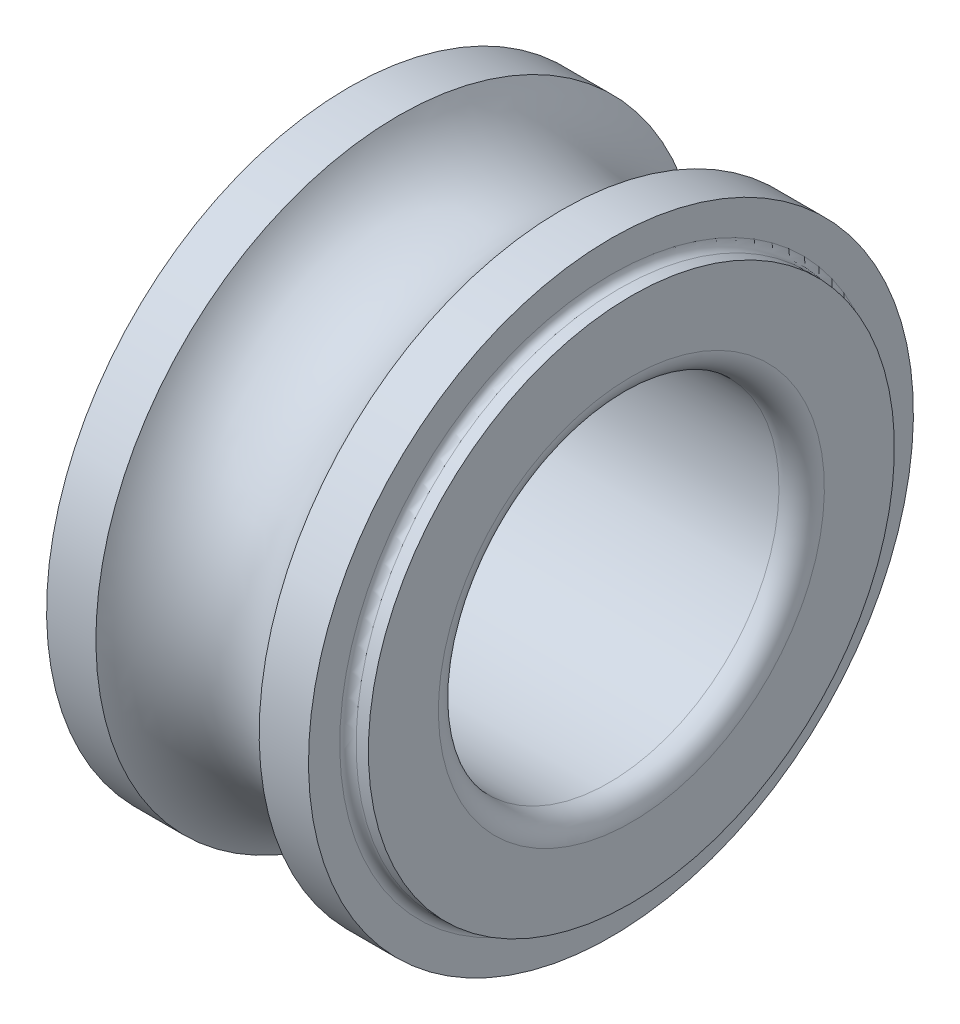
ISO-10303-21;
HEADER;
FILE_DESCRIPTION(('STEP AP214'),'2;1');
FILE_NAME('part.step','',(''),(''),'','','');
FILE_SCHEMA(('AUTOMOTIVE_DESIGN { 1 0 10303 214 1 1 1 1 }'));
ENDSEC;
DATA;
#1=APPLICATION_CONTEXT('core data for automotive mechanical design processes');
#2=APPLICATION_PROTOCOL_DEFINITION('international standard','automotive_design',2000,#1);
#3=PRODUCT_CONTEXT('',#1,'mechanical');
#4=PRODUCT('Part','Part','',(#3));
#5=PRODUCT_RELATED_PRODUCT_CATEGORY('part','',(#4));
#6=PRODUCT_DEFINITION_FORMATION('','',#4);
#7=PRODUCT_DEFINITION_CONTEXT('part definition',#1,'design');
#8=PRODUCT_DEFINITION('design','',#6,#7);
#9=PRODUCT_DEFINITION_SHAPE('','',#8);
#10=(LENGTH_UNIT() NAMED_UNIT(*) SI_UNIT(.MILLI.,.METRE.));
#11=(NAMED_UNIT(*) PLANE_ANGLE_UNIT() SI_UNIT($,.RADIAN.));
#12=(NAMED_UNIT(*) SI_UNIT($,.STERADIAN.) SOLID_ANGLE_UNIT());
#13=UNCERTAINTY_MEASURE_WITH_UNIT(LENGTH_MEASURE(1.E-05),#10,'distance_accuracy_value','');
#14=(GEOMETRIC_REPRESENTATION_CONTEXT(3) GLOBAL_UNCERTAINTY_ASSIGNED_CONTEXT((#13)) GLOBAL_UNIT_ASSIGNED_CONTEXT((#10,
#11,#12)) REPRESENTATION_CONTEXT('',''));
#15=CARTESIAN_POINT('',(0.,0.,0.));
#16=DIRECTION('',(0.,0.,1.));
#17=DIRECTION('',(1.,0.,0.));
#18=AXIS2_PLACEMENT_3D('',#15,#16,#17);
#19=CARTESIAN_POINT('',(0.54,7.57925,0.));
#20=DIRECTION('',(-1.,0.,0.));
#21=DIRECTION('',(0.,-1.,0.));
#22=AXIS2_PLACEMENT_3D('',#19,#20,#21);
#23=PLANE('',#22);
#24=CARTESIAN_POINT('',(0.54,0.,0.));
#25=DIRECTION('',(1.,0.,0.));
#26=DIRECTION('',(0.,1.,0.));
#27=AXIS2_PLACEMENT_3D('',#24,#25,#26);
#28=CIRCLE('',#27,7.166);
#29=CARTESIAN_POINT('',(0.54,7.166,0.));
#30=VERTEX_POINT('',#29);
#31=EDGE_CURVE('E11',#30,#30,#28,.T.);
#32=ORIENTED_EDGE('',*,*,#31,.T.);
#33=EDGE_LOOP('',(#32));
#34=FACE_BOUND('',#33,.T.);
#35=CARTESIAN_POINT('',(0.54,0.,0.));
#36=DIRECTION('',(1.,0.,0.));
#37=DIRECTION('',(0.,1.,0.));
#38=AXIS2_PLACEMENT_3D('',#35,#36,#37);
#39=CIRCLE('',#38,7.9925);
#40=CARTESIAN_POINT('',(0.54,7.9925,0.));
#41=VERTEX_POINT('',#40);
#42=EDGE_CURVE('E75',#41,#41,#39,.T.);
#43=ORIENTED_EDGE('',*,*,#42,.F.);
#44=EDGE_LOOP('',(#43));
#45=FACE_BOUND('',#44,.T.);
#46=ADVANCED_FACE('F16',(#34,#45),#23,.T.);
#47=CARTESIAN_POINT('',(0.324,0.,0.));
#48=DIRECTION('',(1.,0.,0.));
#49=DIRECTION('',(0.,0.,-1.));
#50=AXIS2_PLACEMENT_3D('',#47,#48,#49);
#51=TOROIDAL_SURFACE('',#50,7.166,0.216);
#52=CARTESIAN_POINT('',(0.324,0.,0.));
#53=DIRECTION('',(1.,0.,0.));
#54=DIRECTION('',(0.,1.,0.));
#55=AXIS2_PLACEMENT_3D('',#52,#53,#54);
#56=CIRCLE('',#55,6.95);
#57=CARTESIAN_POINT('',(0.324,6.95,0.));
#58=VERTEX_POINT('',#57);
#59=EDGE_CURVE('E24',#58,#58,#56,.T.);
#60=ORIENTED_EDGE('',*,*,#59,.T.);
#61=EDGE_LOOP('',(#60));
#62=FACE_BOUND('',#61,.T.);
#63=ORIENTED_EDGE('',*,*,#31,.F.);
#64=EDGE_LOOP('',(#63));
#65=FACE_BOUND('',#64,.T.);
#66=ADVANCED_FACE('F121',(#62,#65),#51,.F.);
#67=CARTESIAN_POINT('',(0.162,0.,0.));
#68=DIRECTION('',(-1.,0.,0.));
#69=DIRECTION('',(0.,1.,0.));
#70=AXIS2_PLACEMENT_3D('',#67,#68,#69);
#71=CYLINDRICAL_SURFACE('',#70,6.95);
#72=CARTESIAN_POINT('',(0.,0.,0.));
#73=DIRECTION('',(1.,0.,0.));
#74=DIRECTION('',(0.,1.,0.));
#75=AXIS2_PLACEMENT_3D('',#72,#73,#74);
#76=CIRCLE('',#75,6.95);
#77=CARTESIAN_POINT('',(0.,6.95,0.));
#78=VERTEX_POINT('',#77);
#79=EDGE_CURVE('E92',#78,#78,#76,.T.);
#80=ORIENTED_EDGE('',*,*,#79,.T.);
#81=EDGE_LOOP('',(#80));
#82=FACE_BOUND('',#81,.T.);
#83=ORIENTED_EDGE('',*,*,#59,.F.);
#84=EDGE_LOOP('',(#83));
#85=FACE_BOUND('',#84,.T.);
#86=ADVANCED_FACE('F125',(#82,#85),#71,.T.);
#87=CARTESIAN_POINT('',(0.,6.025,0.));
#88=DIRECTION('',(-1.,0.,0.));
#89=DIRECTION('',(0.,-1.,0.));
#90=AXIS2_PLACEMENT_3D('',#87,#88,#89);
#91=PLANE('',#90);
#92=CARTESIAN_POINT('',(0.,0.,0.));
#93=DIRECTION('',(1.,0.,0.));
#94=DIRECTION('',(0.,1.,0.));
#95=AXIS2_PLACEMENT_3D('',#92,#93,#94);
#96=CIRCLE('',#95,5.1);
#97=CARTESIAN_POINT('',(0.,5.1,0.));
#98=VERTEX_POINT('',#97);
#99=EDGE_CURVE('E90',#98,#98,#96,.T.);
#100=ORIENTED_EDGE('',*,*,#99,.T.);
#101=EDGE_LOOP('',(#100));
#102=FACE_BOUND('',#101,.T.);
#103=ORIENTED_EDGE('',*,*,#79,.F.);
#104=EDGE_LOOP('',(#103));
#105=FACE_BOUND('',#104,.T.);
#106=ADVANCED_FACE('F130',(#102,#105),#91,.T.);
#107=CARTESIAN_POINT('',(0.6,0.,0.));
#108=DIRECTION('',(1.,0.,0.));
#109=DIRECTION('',(0.,0.,-1.));
#110=AXIS2_PLACEMENT_3D('',#107,#108,#109);
#111=TOROIDAL_SURFACE('',#110,5.1,0.6);
#112=CARTESIAN_POINT('',(0.6,0.,0.));
#113=DIRECTION('',(1.,0.,0.));
#114=DIRECTION('',(0.,1.,0.));
#115=AXIS2_PLACEMENT_3D('',#112,#113,#114);
#116=CIRCLE('',#115,4.5);
#117=CARTESIAN_POINT('',(0.6,4.5,0.));
#118=VERTEX_POINT('',#117);
#119=EDGE_CURVE('E93',#118,#118,#116,.T.);
#120=ORIENTED_EDGE('',*,*,#119,.T.);
#121=EDGE_LOOP('',(#120));
#122=FACE_BOUND('',#121,.T.);
#123=ORIENTED_EDGE('',*,*,#99,.F.);
#124=EDGE_LOOP('',(#123));
#125=FACE_BOUND('',#124,.T.);
#126=ADVANCED_FACE('F135',(#122,#125),#111,.T.);
#127=CARTESIAN_POINT('',(4.,0.,0.));
#128=DIRECTION('',(-1.,0.,0.));
#129=DIRECTION('',(0.,1.,0.));
#130=AXIS2_PLACEMENT_3D('',#127,#128,#129);
#131=CYLINDRICAL_SURFACE('',#130,4.5);
#132=CARTESIAN_POINT('',(7.4,0.,0.));
#133=DIRECTION('',(1.,0.,0.));
#134=DIRECTION('',(0.,1.,0.));
#135=AXIS2_PLACEMENT_3D('',#132,#133,#134);
#136=CIRCLE('',#135,4.5);
#137=CARTESIAN_POINT('',(7.4,4.5,0.));
#138=VERTEX_POINT('',#137);
#139=EDGE_CURVE('E19',#138,#138,#136,.T.);
#140=ORIENTED_EDGE('',*,*,#139,.T.);
#141=EDGE_LOOP('',(#140));
#142=FACE_BOUND('',#141,.T.);
#143=ORIENTED_EDGE('',*,*,#119,.F.);
#144=EDGE_LOOP('',(#143));
#145=FACE_BOUND('',#144,.T.);
#146=ADVANCED_FACE('F138',(#142,#145),#131,.F.);
#147=CARTESIAN_POINT('',(7.4,0.,0.));
#148=DIRECTION('',(1.,0.,0.));
#149=DIRECTION('',(0.,0.,-1.));
#150=AXIS2_PLACEMENT_3D('',#147,#148,#149);
#151=TOROIDAL_SURFACE('',#150,5.1,0.6);
#152=CARTESIAN_POINT('',(8.,0.,0.));
#153=DIRECTION('',(1.,0.,0.));
#154=DIRECTION('',(0.,1.,0.));
#155=AXIS2_PLACEMENT_3D('',#152,#153,#154);
#156=CIRCLE('',#155,5.1);
#157=CARTESIAN_POINT('',(8.,5.1,0.));
#158=VERTEX_POINT('',#157);
#159=EDGE_CURVE('E61',#158,#158,#156,.T.);
#160=ORIENTED_EDGE('',*,*,#159,.T.);
#161=EDGE_LOOP('',(#160));
#162=FACE_BOUND('',#161,.T.);
#163=ORIENTED_EDGE('',*,*,#139,.F.);
#164=EDGE_LOOP('',(#163));
#165=FACE_BOUND('',#164,.T.);
#166=ADVANCED_FACE('F192',(#162,#165),#151,.T.);
#167=CARTESIAN_POINT('',(8.,6.025,0.));
#168=DIRECTION('',(1.,0.,0.));
#169=DIRECTION('',(0.,1.,0.));
#170=AXIS2_PLACEMENT_3D('',#167,#168,#169);
#171=PLANE('',#170);
#172=CARTESIAN_POINT('',(8.,0.,0.));
#173=DIRECTION('',(1.,0.,0.));
#174=DIRECTION('',(0.,1.,0.));
#175=AXIS2_PLACEMENT_3D('',#172,#173,#174);
#176=CIRCLE('',#175,6.95);
#177=CARTESIAN_POINT('',(8.,6.95,0.));
#178=VERTEX_POINT('',#177);
#179=EDGE_CURVE('E87',#178,#178,#176,.T.);
#180=ORIENTED_EDGE('',*,*,#179,.T.);
#181=EDGE_LOOP('',(#180));
#182=FACE_BOUND('',#181,.T.);
#183=ORIENTED_EDGE('',*,*,#159,.F.);
#184=EDGE_LOOP('',(#183));
#185=FACE_BOUND('',#184,.T.);
#186=ADVANCED_FACE('F183',(#182,#185),#171,.T.);
#187=CARTESIAN_POINT('',(7.838,0.,0.));
#188=DIRECTION('',(-1.,0.,0.));
#189=DIRECTION('',(0.,1.,0.));
#190=AXIS2_PLACEMENT_3D('',#187,#188,#189);
#191=CYLINDRICAL_SURFACE('',#190,6.95);
#192=CARTESIAN_POINT('',(7.676,0.,0.));
#193=DIRECTION('',(1.,0.,0.));
#194=DIRECTION('',(0.,1.,0.));
#195=AXIS2_PLACEMENT_3D('',#192,#193,#194);
#196=CIRCLE('',#195,6.95);
#197=CARTESIAN_POINT('',(7.676,6.95,0.));
#198=VERTEX_POINT('',#197);
#199=EDGE_CURVE('E86',#198,#198,#196,.T.);
#200=ORIENTED_EDGE('',*,*,#199,.T.);
#201=EDGE_LOOP('',(#200));
#202=FACE_BOUND('',#201,.T.);
#203=ORIENTED_EDGE('',*,*,#179,.F.);
#204=EDGE_LOOP('',(#203));
#205=FACE_BOUND('',#204,.T.);
#206=ADVANCED_FACE('F173',(#202,#205),#191,.T.);
#207=CARTESIAN_POINT('',(7.676,0.,0.));
#208=DIRECTION('',(1.,0.,0.));
#209=DIRECTION('',(0.,0.,-1.));
#210=AXIS2_PLACEMENT_3D('',#207,#208,#209);
#211=TOROIDAL_SURFACE('',#210,7.166,0.216);
#212=CARTESIAN_POINT('',(7.46,0.,0.));
#213=DIRECTION('',(1.,0.,0.));
#214=DIRECTION('',(0.,1.,0.));
#215=AXIS2_PLACEMENT_3D('',#212,#213,#214);
#216=CIRCLE('',#215,7.166);
#217=CARTESIAN_POINT('',(7.46,7.166,0.));
#218=VERTEX_POINT('',#217);
#219=EDGE_CURVE('E88',#218,#218,#216,.T.);
#220=ORIENTED_EDGE('',*,*,#219,.T.);
#221=EDGE_LOOP('',(#220));
#222=FACE_BOUND('',#221,.T.);
#223=ORIENTED_EDGE('',*,*,#199,.F.);
#224=EDGE_LOOP('',(#223));
#225=FACE_BOUND('',#224,.T.);
#226=ADVANCED_FACE('F116',(#222,#225),#211,.F.);
#227=CARTESIAN_POINT('',(7.46,7.57925,0.));
#228=DIRECTION('',(1.,0.,0.));
#229=DIRECTION('',(0.,1.,0.));
#230=AXIS2_PLACEMENT_3D('',#227,#228,#229);
#231=PLANE('',#230);
#232=CARTESIAN_POINT('',(7.46,0.,0.));
#233=DIRECTION('',(1.,0.,0.));
#234=DIRECTION('',(0.,1.,0.));
#235=AXIS2_PLACEMENT_3D('',#232,#233,#234);
#236=CIRCLE('',#235,7.9925);
#237=CARTESIAN_POINT('',(7.46,7.9925,0.));
#238=VERTEX_POINT('',#237);
#239=EDGE_CURVE('E82',#238,#238,#236,.T.);
#240=ORIENTED_EDGE('',*,*,#239,.T.);
#241=EDGE_LOOP('',(#240));
#242=FACE_BOUND('',#241,.T.);
#243=ORIENTED_EDGE('',*,*,#219,.F.);
#244=EDGE_LOOP('',(#243));
#245=FACE_BOUND('',#244,.T.);
#246=ADVANCED_FACE('F101',(#242,#245),#231,.T.);
#247=CARTESIAN_POINT('',(6.80866871072633,0.,0.));
#248=DIRECTION('',(-1.,0.,0.));
#249=DIRECTION('',(0.,1.,0.));
#250=AXIS2_PLACEMENT_3D('',#247,#248,#249);
#251=CYLINDRICAL_SURFACE('',#250,7.9925);
#252=CARTESIAN_POINT('',(6.15733742145266,0.,0.));
#253=DIRECTION('',(1.,0.,0.));
#254=DIRECTION('',(0.,1.,0.));
#255=AXIS2_PLACEMENT_3D('',#252,#253,#254);
#256=CIRCLE('',#255,7.9925);
#257=CARTESIAN_POINT('',(6.15733742145266,7.9925,0.));
#258=VERTEX_POINT('',#257);
#259=EDGE_CURVE('E79',#258,#258,#256,.T.);
#260=ORIENTED_EDGE('',*,*,#259,.T.);
#261=EDGE_LOOP('',(#260));
#262=FACE_BOUND('',#261,.T.);
#263=ORIENTED_EDGE('',*,*,#239,.F.);
#264=EDGE_LOOP('',(#263));
#265=FACE_BOUND('',#264,.T.);
#266=ADVANCED_FACE('F104',(#262,#265),#251,.T.);
#267=CARTESIAN_POINT('',(4.,0.,0.));
#268=DIRECTION('',(1.,0.,0.));
#269=DIRECTION('',(0.,0.,-1.));
#270=AXIS2_PLACEMENT_3D('',#267,#268,#269);
#271=TOROIDAL_SURFACE('',#270,9.,2.381);
#272=CARTESIAN_POINT('',(1.84266257854734,0.,0.));
#273=DIRECTION('',(1.,0.,0.));
#274=DIRECTION('',(0.,1.,0.));
#275=AXIS2_PLACEMENT_3D('',#272,#273,#274);
#276=CIRCLE('',#275,7.9925);
#277=CARTESIAN_POINT('',(1.84266257854734,7.9925,0.));
#278=VERTEX_POINT('',#277);
#279=EDGE_CURVE('E80',#278,#278,#276,.T.);
#280=ORIENTED_EDGE('',*,*,#279,.T.);
#281=EDGE_LOOP('',(#280));
#282=FACE_BOUND('',#281,.T.);
#283=ORIENTED_EDGE('',*,*,#259,.F.);
#284=EDGE_LOOP('',(#283));
#285=FACE_BOUND('',#284,.T.);
#286=ADVANCED_FACE('F106',(#282,#285),#271,.F.);
#287=CARTESIAN_POINT('',(1.19133128927367,0.,0.));
#288=DIRECTION('',(-1.,0.,0.));
#289=DIRECTION('',(0.,1.,0.));
#290=AXIS2_PLACEMENT_3D('',#287,#288,#289);
#291=CYLINDRICAL_SURFACE('',#290,7.9925);
#292=ORIENTED_EDGE('',*,*,#42,.T.);
#293=EDGE_LOOP('',(#292));
#294=FACE_BOUND('',#293,.T.);
#295=ORIENTED_EDGE('',*,*,#279,.F.);
#296=EDGE_LOOP('',(#295));
#297=FACE_BOUND('',#296,.T.);
#298=ADVANCED_FACE('F76',(#294,#297),#291,.T.);
#299=CLOSED_SHELL('',(#46,#66,#86,#106,#126,#146,#166,#186,#206,#226,#246,#266,#286,#298));
#300=MANIFOLD_SOLID_BREP('B1',#299);
#301=ADVANCED_BREP_SHAPE_REPRESENTATION('',(#18,#300),#14);
#302=SHAPE_DEFINITION_REPRESENTATION(#9,#301);
ENDSEC;
END-ISO-10303-21;
